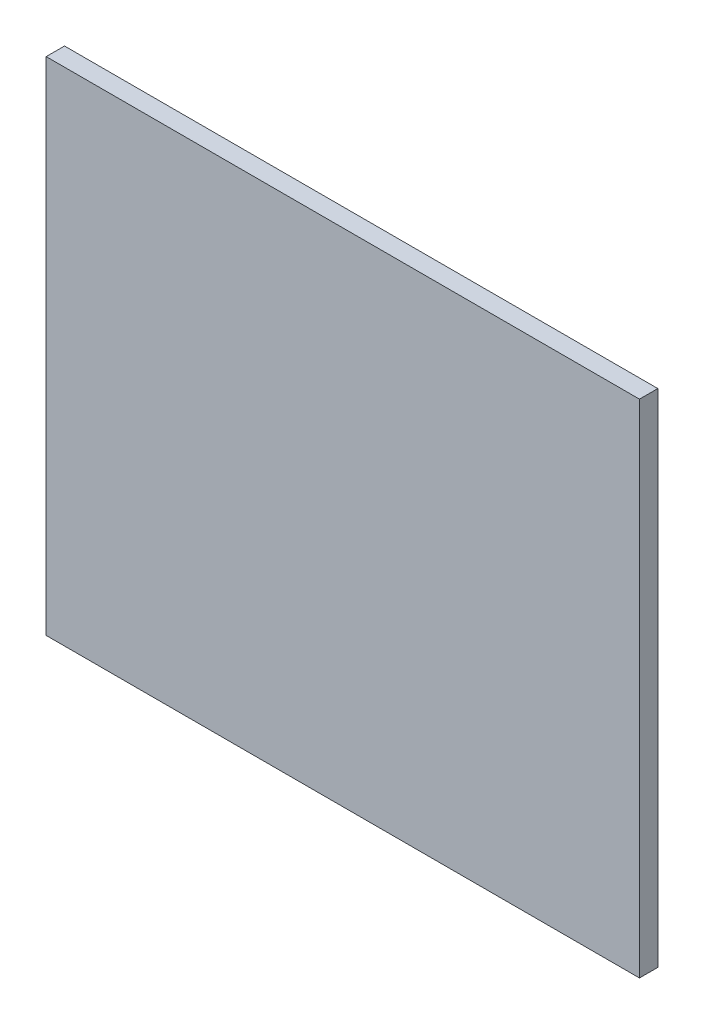
ISO-10303-21;
HEADER;
FILE_DESCRIPTION(('STEP AP214'),'2;1');
FILE_NAME('part.step','',(''),(''),'','','');
FILE_SCHEMA(('AUTOMOTIVE_DESIGN { 1 0 10303 214 1 1 1 1 }'));
ENDSEC;
DATA;
#1=APPLICATION_CONTEXT('core data for automotive mechanical design processes');
#2=APPLICATION_PROTOCOL_DEFINITION('international standard','automotive_design',2000,#1);
#3=PRODUCT_CONTEXT('',#1,'mechanical');
#4=PRODUCT('Part','Part','',(#3));
#5=PRODUCT_RELATED_PRODUCT_CATEGORY('part','',(#4));
#6=PRODUCT_DEFINITION_FORMATION('','',#4);
#7=PRODUCT_DEFINITION_CONTEXT('part definition',#1,'design');
#8=PRODUCT_DEFINITION('design','',#6,#7);
#9=PRODUCT_DEFINITION_SHAPE('','',#8);
#10=(LENGTH_UNIT() NAMED_UNIT(*) SI_UNIT(.MILLI.,.METRE.));
#11=(NAMED_UNIT(*) PLANE_ANGLE_UNIT() SI_UNIT($,.RADIAN.));
#12=(NAMED_UNIT(*) SI_UNIT($,.STERADIAN.) SOLID_ANGLE_UNIT());
#13=UNCERTAINTY_MEASURE_WITH_UNIT(LENGTH_MEASURE(1.E-05),#10,'distance_accuracy_value','');
#14=(GEOMETRIC_REPRESENTATION_CONTEXT(3) GLOBAL_UNCERTAINTY_ASSIGNED_CONTEXT((#13)) GLOBAL_UNIT_ASSIGNED_CONTEXT((#10,
#11,#12)) REPRESENTATION_CONTEXT('',''));
#15=CARTESIAN_POINT('',(0.,0.,0.));
#16=DIRECTION('',(0.,0.,1.));
#17=DIRECTION('',(1.,0.,0.));
#18=AXIS2_PLACEMENT_3D('',#15,#16,#17);
#19=CARTESIAN_POINT('',(-97.,-81.96,6.));
#20=DIRECTION('',(1.,0.,0.));
#21=DIRECTION('',(0.,0.,-1.));
#22=AXIS2_PLACEMENT_3D('',#19,#20,#21);
#23=PLANE('',#22);
#24=DIRECTION('',(0.,-1.,0.));
#25=VECTOR('',#24,1.);
#26=CARTESIAN_POINT('',(-97.,-81.96,0.));
#27=LINE('',#26,#25);
#28=CARTESIAN_POINT('',(-97.,81.96,0.));
#29=VERTEX_POINT('',#28);
#30=CARTESIAN_POINT('',(-97.,-81.96,0.));
#31=VERTEX_POINT('',#30);
#32=EDGE_CURVE('E98',#29,#31,#27,.T.);
#33=ORIENTED_EDGE('',*,*,#32,.T.);
#34=DIRECTION('',(0.,0.,-1.));
#35=VECTOR('',#34,1.);
#36=CARTESIAN_POINT('',(-97.,-81.96,6.));
#37=LINE('',#36,#35);
#38=CARTESIAN_POINT('',(-97.,-81.96,6.));
#39=VERTEX_POINT('',#38);
#40=EDGE_CURVE('E11',#39,#31,#37,.T.);
#41=ORIENTED_EDGE('',*,*,#40,.F.);
#42=DIRECTION('',(0.,-1.,0.));
#43=VECTOR('',#42,1.);
#44=CARTESIAN_POINT('',(-97.,-81.96,6.));
#45=LINE('',#44,#43);
#46=CARTESIAN_POINT('',(-97.,81.96,6.));
#47=VERTEX_POINT('',#46);
#48=EDGE_CURVE('E86',#47,#39,#45,.T.);
#49=ORIENTED_EDGE('',*,*,#48,.F.);
#50=DIRECTION('',(0.,0.,-1.));
#51=VECTOR('',#50,1.);
#52=CARTESIAN_POINT('',(-97.,81.96,6.));
#53=LINE('',#52,#51);
#54=EDGE_CURVE('E94',#47,#29,#53,.T.);
#55=ORIENTED_EDGE('',*,*,#54,.T.);
#56=EDGE_LOOP('',(#33,#41,#49,#55));
#57=FACE_BOUND('',#56,.T.);
#58=ADVANCED_FACE('F35',(#57),#23,.F.);
#59=CARTESIAN_POINT('',(97.,-81.96,6.));
#60=DIRECTION('',(0.,1.,0.));
#61=DIRECTION('',(-1.,0.,0.));
#62=AXIS2_PLACEMENT_3D('',#59,#60,#61);
#63=PLANE('',#62);
#64=DIRECTION('',(1.,0.,0.));
#65=VECTOR('',#64,1.);
#66=CARTESIAN_POINT('',(97.,-81.96,0.));
#67=LINE('',#66,#65);
#68=CARTESIAN_POINT('',(97.,-81.96,0.));
#69=VERTEX_POINT('',#68);
#70=EDGE_CURVE('E90',#31,#69,#67,.T.);
#71=ORIENTED_EDGE('',*,*,#70,.T.);
#72=DIRECTION('',(0.,0.,-1.));
#73=VECTOR('',#72,1.);
#74=CARTESIAN_POINT('',(97.,-81.96,6.));
#75=LINE('',#74,#73);
#76=CARTESIAN_POINT('',(97.,-81.96,6.));
#77=VERTEX_POINT('',#76);
#78=EDGE_CURVE('E43',#77,#69,#75,.T.);
#79=ORIENTED_EDGE('',*,*,#78,.F.);
#80=DIRECTION('',(1.,0.,0.));
#81=VECTOR('',#80,1.);
#82=CARTESIAN_POINT('',(97.,-81.96,6.));
#83=LINE('',#82,#81);
#84=EDGE_CURVE('E81',#39,#77,#83,.T.);
#85=ORIENTED_EDGE('',*,*,#84,.F.);
#86=ORIENTED_EDGE('',*,*,#40,.T.);
#87=EDGE_LOOP('',(#71,#79,#85,#86));
#88=FACE_BOUND('',#87,.T.);
#89=ADVANCED_FACE('F89',(#88),#63,.F.);
#90=CARTESIAN_POINT('',(97.,-81.96,6.));
#91=DIRECTION('',(-1.,0.,0.));
#92=DIRECTION('',(0.,0.,1.));
#93=AXIS2_PLACEMENT_3D('',#90,#91,#92);
#94=PLANE('',#93);
#95=DIRECTION('',(0.,1.,0.));
#96=VECTOR('',#95,1.);
#97=CARTESIAN_POINT('',(97.,-81.96,0.));
#98=LINE('',#97,#96);
#99=CARTESIAN_POINT('',(97.,81.96,0.));
#100=VERTEX_POINT('',#99);
#101=EDGE_CURVE('E68',#69,#100,#98,.T.);
#102=ORIENTED_EDGE('',*,*,#101,.T.);
#103=DIRECTION('',(0.,0.,-1.));
#104=VECTOR('',#103,1.);
#105=CARTESIAN_POINT('',(97.,81.96,6.));
#106=LINE('',#105,#104);
#107=CARTESIAN_POINT('',(97.,81.96,6.));
#108=VERTEX_POINT('',#107);
#109=EDGE_CURVE('E91',#108,#100,#106,.T.);
#110=ORIENTED_EDGE('',*,*,#109,.F.);
#111=DIRECTION('',(0.,1.,0.));
#112=VECTOR('',#111,1.);
#113=CARTESIAN_POINT('',(97.,-81.96,6.));
#114=LINE('',#113,#112);
#115=EDGE_CURVE('E84',#77,#108,#114,.T.);
#116=ORIENTED_EDGE('',*,*,#115,.F.);
#117=ORIENTED_EDGE('',*,*,#78,.T.);
#118=EDGE_LOOP('',(#102,#110,#116,#117));
#119=FACE_BOUND('',#118,.T.);
#120=ADVANCED_FACE('F92',(#119),#94,.F.);
#121=CARTESIAN_POINT('',(97.,81.96,6.));
#122=DIRECTION('',(0.,-1.,0.));
#123=DIRECTION('',(1.,0.,0.));
#124=AXIS2_PLACEMENT_3D('',#121,#122,#123);
#125=PLANE('',#124);
#126=DIRECTION('',(-1.,0.,0.));
#127=VECTOR('',#126,1.);
#128=CARTESIAN_POINT('',(97.,81.96,0.));
#129=LINE('',#128,#127);
#130=EDGE_CURVE('E74',#100,#29,#129,.T.);
#131=ORIENTED_EDGE('',*,*,#130,.T.);
#132=ORIENTED_EDGE('',*,*,#54,.F.);
#133=DIRECTION('',(-1.,0.,0.));
#134=VECTOR('',#133,1.);
#135=CARTESIAN_POINT('',(97.,81.96,6.));
#136=LINE('',#135,#134);
#137=EDGE_CURVE('E51',#108,#47,#136,.T.);
#138=ORIENTED_EDGE('',*,*,#137,.F.);
#139=ORIENTED_EDGE('',*,*,#109,.T.);
#140=EDGE_LOOP('',(#131,#132,#138,#139));
#141=FACE_BOUND('',#140,.T.);
#142=ADVANCED_FACE('F105',(#141),#125,.F.);
#143=CARTESIAN_POINT('',(0.,0.,6.));
#144=DIRECTION('',(0.,0.,1.));
#145=DIRECTION('',(1.,0.,0.));
#146=AXIS2_PLACEMENT_3D('',#143,#144,#145);
#147=PLANE('',#146);
#148=ORIENTED_EDGE('',*,*,#48,.T.);
#149=ORIENTED_EDGE('',*,*,#84,.T.);
#150=ORIENTED_EDGE('',*,*,#115,.T.);
#151=ORIENTED_EDGE('',*,*,#137,.T.);
#152=EDGE_LOOP('',(#148,#149,#150,#151));
#153=FACE_BOUND('',#152,.T.);
#154=ADVANCED_FACE('F82',(#153),#147,.T.);
#155=CARTESIAN_POINT('',(0.,0.,0.));
#156=DIRECTION('',(0.,0.,1.));
#157=DIRECTION('',(1.,0.,0.));
#158=AXIS2_PLACEMENT_3D('',#155,#156,#157);
#159=PLANE('',#158);
#160=ORIENTED_EDGE('',*,*,#32,.F.);
#161=ORIENTED_EDGE('',*,*,#130,.F.);
#162=ORIENTED_EDGE('',*,*,#101,.F.);
#163=ORIENTED_EDGE('',*,*,#70,.F.);
#164=EDGE_LOOP('',(#160,#161,#162,#163));
#165=FACE_BOUND('',#164,.T.);
#166=ADVANCED_FACE('F108',(#165),#159,.F.);
#167=CLOSED_SHELL('',(#58,#89,#120,#142,#154,#166));
#168=MANIFOLD_SOLID_BREP('B2',#167);
#169=ADVANCED_BREP_SHAPE_REPRESENTATION('',(#18,#168),#14);
#170=SHAPE_DEFINITION_REPRESENTATION(#9,#169);
ENDSEC;
END-ISO-10303-21;
